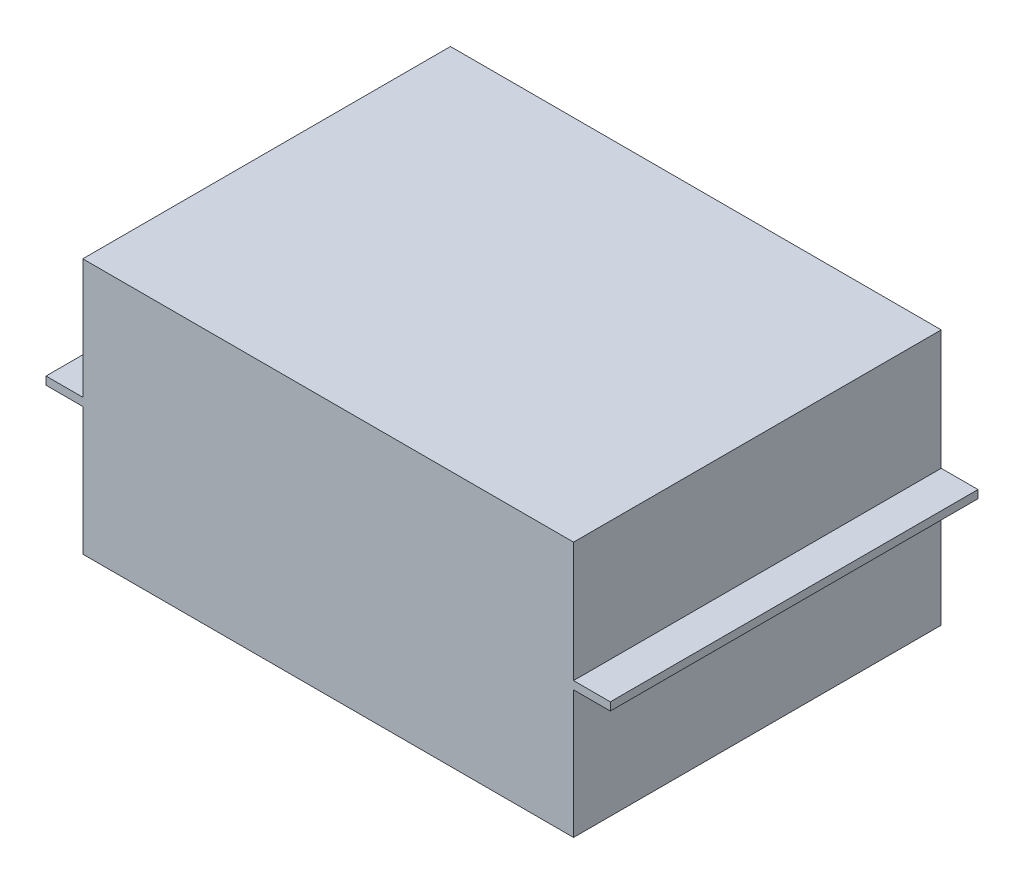
ISO-10303-21;
HEADER;
FILE_DESCRIPTION(('STEP AP214'),'2;1');
FILE_NAME('part.step','',(''),(''),'','','');
FILE_SCHEMA(('AUTOMOTIVE_DESIGN { 1 0 10303 214 1 1 1 1 }'));
ENDSEC;
DATA;
#1=APPLICATION_CONTEXT('core data for automotive mechanical design processes');
#2=APPLICATION_PROTOCOL_DEFINITION('international standard','automotive_design',2000,#1);
#3=PRODUCT_CONTEXT('',#1,'mechanical');
#4=PRODUCT('Part','Part','',(#3));
#5=PRODUCT_RELATED_PRODUCT_CATEGORY('part','',(#4));
#6=PRODUCT_DEFINITION_FORMATION('','',#4);
#7=PRODUCT_DEFINITION_CONTEXT('part definition',#1,'design');
#8=PRODUCT_DEFINITION('design','',#6,#7);
#9=PRODUCT_DEFINITION_SHAPE('','',#8);
#10=(LENGTH_UNIT() NAMED_UNIT(*) SI_UNIT(.MILLI.,.METRE.));
#11=(NAMED_UNIT(*) PLANE_ANGLE_UNIT() SI_UNIT($,.RADIAN.));
#12=(NAMED_UNIT(*) SI_UNIT($,.STERADIAN.) SOLID_ANGLE_UNIT());
#13=UNCERTAINTY_MEASURE_WITH_UNIT(LENGTH_MEASURE(1.E-05),#10,'distance_accuracy_value','');
#14=(GEOMETRIC_REPRESENTATION_CONTEXT(3) GLOBAL_UNCERTAINTY_ASSIGNED_CONTEXT((#13)) GLOBAL_UNIT_ASSIGNED_CONTEXT((#10,
#11,#12)) REPRESENTATION_CONTEXT('',''));
#15=CARTESIAN_POINT('',(0.,0.,0.));
#16=DIRECTION('',(0.,0.,1.));
#17=DIRECTION('',(1.,0.,0.));
#18=AXIS2_PLACEMENT_3D('',#15,#16,#17);
#19=CARTESIAN_POINT('',(153.5,160.,0.));
#20=DIRECTION('',(-1.,0.,0.));
#21=DIRECTION('',(0.,0.,1.));
#22=AXIS2_PLACEMENT_3D('',#19,#20,#21);
#23=PLANE('',#22);
#24=DIRECTION('',(0.,0.,-1.));
#25=VECTOR('',#24,1.);
#26=CARTESIAN_POINT('',(153.5,80.,0.));
#27=LINE('',#26,#25);
#28=CARTESIAN_POINT('',(153.5,80.,115.));
#29=VERTEX_POINT('',#28);
#30=CARTESIAN_POINT('',(153.5,80.,-115.));
#31=VERTEX_POINT('',#30);
#32=EDGE_CURVE('E154',#29,#31,#27,.T.);
#33=ORIENTED_EDGE('',*,*,#32,.F.);
#34=DIRECTION('',(0.,-1.,0.));
#35=VECTOR('',#34,1.);
#36=CARTESIAN_POINT('',(153.5,160.,115.));
#37=LINE('',#36,#35);
#38=CARTESIAN_POINT('',(153.5,0.,115.));
#39=VERTEX_POINT('',#38);
#40=EDGE_CURVE('E56',#29,#39,#37,.T.);
#41=ORIENTED_EDGE('',*,*,#40,.T.);
#42=DIRECTION('',(0.,0.,-1.));
#43=VECTOR('',#42,1.);
#44=CARTESIAN_POINT('',(153.5,0.,0.));
#45=LINE('',#44,#43);
#46=CARTESIAN_POINT('',(153.5,0.,-115.));
#47=VERTEX_POINT('',#46);
#48=EDGE_CURVE('E221',#39,#47,#45,.T.);
#49=ORIENTED_EDGE('',*,*,#48,.T.);
#50=DIRECTION('',(0.,-1.,0.));
#51=VECTOR('',#50,1.);
#52=CARTESIAN_POINT('',(153.5,160.,-115.));
#53=LINE('',#52,#51);
#54=EDGE_CURVE('E239',#31,#47,#53,.T.);
#55=ORIENTED_EDGE('',*,*,#54,.F.);
#56=EDGE_LOOP('',(#33,#41,#49,#55));
#57=FACE_BOUND('',#56,.T.);
#58=ADVANCED_FACE('F47',(#57),#23,.F.);
#59=CARTESIAN_POINT('',(-153.5,160.,0.));
#60=DIRECTION('',(-1.,0.,0.));
#61=DIRECTION('',(0.,0.,1.));
#62=AXIS2_PLACEMENT_3D('',#59,#60,#61);
#63=PLANE('',#62);
#64=DIRECTION('',(0.,-1.,0.));
#65=VECTOR('',#64,1.);
#66=CARTESIAN_POINT('',(-153.5,160.,115.));
#67=LINE('',#66,#65);
#68=CARTESIAN_POINT('',(-153.5,80.,115.));
#69=VERTEX_POINT('',#68);
#70=CARTESIAN_POINT('',(-153.5,0.,115.));
#71=VERTEX_POINT('',#70);
#72=EDGE_CURVE('E218',#69,#71,#67,.T.);
#73=ORIENTED_EDGE('',*,*,#72,.F.);
#74=DIRECTION('',(0.,0.,-1.));
#75=VECTOR('',#74,1.);
#76=CARTESIAN_POINT('',(-153.5,80.,0.));
#77=LINE('',#76,#75);
#78=CARTESIAN_POINT('',(-153.5,80.,-115.));
#79=VERTEX_POINT('',#78);
#80=EDGE_CURVE('E71',#69,#79,#77,.T.);
#81=ORIENTED_EDGE('',*,*,#80,.T.);
#82=DIRECTION('',(0.,-1.,0.));
#83=VECTOR('',#82,1.);
#84=CARTESIAN_POINT('',(-153.5,160.,-115.));
#85=LINE('',#84,#83);
#86=CARTESIAN_POINT('',(-153.5,0.,-115.));
#87=VERTEX_POINT('',#86);
#88=EDGE_CURVE('E236',#79,#87,#85,.T.);
#89=ORIENTED_EDGE('',*,*,#88,.T.);
#90=DIRECTION('',(0.,0.,-1.));
#91=VECTOR('',#90,1.);
#92=CARTESIAN_POINT('',(-153.5,0.,0.));
#93=LINE('',#92,#91);
#94=EDGE_CURVE('E207',#71,#87,#93,.T.);
#95=ORIENTED_EDGE('',*,*,#94,.F.);
#96=EDGE_LOOP('',(#73,#81,#89,#95));
#97=FACE_BOUND('',#96,.T.);
#98=ADVANCED_FACE('F260',(#97),#63,.T.);
#99=CARTESIAN_POINT('',(0.,160.,115.));
#100=DIRECTION('',(0.,0.,-1.));
#101=DIRECTION('',(-1.,0.,0.));
#102=AXIS2_PLACEMENT_3D('',#99,#100,#101);
#103=PLANE('',#102);
#104=DIRECTION('',(1.,0.,0.));
#105=VECTOR('',#104,1.);
#106=CARTESIAN_POINT('',(0.,0.,115.));
#107=LINE('',#106,#105);
#108=EDGE_CURVE('E201',#71,#39,#107,.T.);
#109=ORIENTED_EDGE('',*,*,#108,.T.);
#110=ORIENTED_EDGE('',*,*,#40,.F.);
#111=DIRECTION('',(1.,0.,0.));
#112=VECTOR('',#111,1.);
#113=CARTESIAN_POINT('',(0.,80.,115.));
#114=LINE('',#113,#112);
#115=CARTESIAN_POINT('',(176.5,80.,115.));
#116=VERTEX_POINT('',#115);
#117=EDGE_CURVE('E158',#29,#116,#114,.T.);
#118=ORIENTED_EDGE('',*,*,#117,.T.);
#119=DIRECTION('',(0.,-1.,0.));
#120=VECTOR('',#119,1.);
#121=CARTESIAN_POINT('',(176.5,85.,115.));
#122=LINE('',#121,#120);
#123=CARTESIAN_POINT('',(176.5,85.,115.));
#124=VERTEX_POINT('',#123);
#125=EDGE_CURVE('E143',#124,#116,#122,.T.);
#126=ORIENTED_EDGE('',*,*,#125,.F.);
#127=DIRECTION('',(1.,0.,0.));
#128=VECTOR('',#127,1.);
#129=CARTESIAN_POINT('',(0.,85.,115.));
#130=LINE('',#129,#128);
#131=CARTESIAN_POINT('',(153.5,85.,115.));
#132=VERTEX_POINT('',#131);
#133=EDGE_CURVE('E147',#132,#124,#130,.T.);
#134=ORIENTED_EDGE('',*,*,#133,.F.);
#135=CARTESIAN_POINT('',(153.5,160.,115.));
#136=VERTEX_POINT('',#135);
#137=EDGE_CURVE('E11',#136,#132,#37,.T.);
#138=ORIENTED_EDGE('',*,*,#137,.F.);
#139=DIRECTION('',(1.,0.,0.));
#140=VECTOR('',#139,1.);
#141=CARTESIAN_POINT('',(0.,160.,115.));
#142=LINE('',#141,#140);
#143=CARTESIAN_POINT('',(-153.5,160.,115.));
#144=VERTEX_POINT('',#143);
#145=EDGE_CURVE('E202',#144,#136,#142,.T.);
#146=ORIENTED_EDGE('',*,*,#145,.F.);
#147=CARTESIAN_POINT('',(-153.5,85.,115.));
#148=VERTEX_POINT('',#147);
#149=EDGE_CURVE('E232',#144,#148,#67,.T.);
#150=ORIENTED_EDGE('',*,*,#149,.T.);
#151=DIRECTION('',(1.,0.,0.));
#152=VECTOR('',#151,1.);
#153=CARTESIAN_POINT('',(0.,85.,115.));
#154=LINE('',#153,#152);
#155=CARTESIAN_POINT('',(-176.5,85.,115.));
#156=VERTEX_POINT('',#155);
#157=EDGE_CURVE('E178',#156,#148,#154,.T.);
#158=ORIENTED_EDGE('',*,*,#157,.F.);
#159=DIRECTION('',(0.,-1.,0.));
#160=VECTOR('',#159,1.);
#161=CARTESIAN_POINT('',(-176.5,85.,115.));
#162=LINE('',#161,#160);
#163=CARTESIAN_POINT('',(-176.5,80.,115.));
#164=VERTEX_POINT('',#163);
#165=EDGE_CURVE('E185',#156,#164,#162,.T.);
#166=ORIENTED_EDGE('',*,*,#165,.T.);
#167=DIRECTION('',(1.,0.,0.));
#168=VECTOR('',#167,1.);
#169=CARTESIAN_POINT('',(0.,80.,115.));
#170=LINE('',#169,#168);
#171=EDGE_CURVE('E190',#164,#69,#170,.T.);
#172=ORIENTED_EDGE('',*,*,#171,.T.);
#173=ORIENTED_EDGE('',*,*,#72,.T.);
#174=EDGE_LOOP('',(#109,#110,#118,#126,#134,#138,#146,#150,#158,#166,#172,#173));
#175=FACE_BOUND('',#174,.T.);
#176=ADVANCED_FACE('F49',(#175),#103,.F.);
#177=ORIENTED_EDGE('',*,*,#137,.T.);
#178=DIRECTION('',(0.,0.,-1.));
#179=VECTOR('',#178,1.);
#180=CARTESIAN_POINT('',(153.5,85.,0.));
#181=LINE('',#180,#179);
#182=CARTESIAN_POINT('',(153.5,85.,-115.));
#183=VERTEX_POINT('',#182);
#184=EDGE_CURVE('E150',#132,#183,#181,.T.);
#185=ORIENTED_EDGE('',*,*,#184,.T.);
#186=CARTESIAN_POINT('',(153.5,160.,-115.));
#187=VERTEX_POINT('',#186);
#188=EDGE_CURVE('E240',#187,#183,#53,.T.);
#189=ORIENTED_EDGE('',*,*,#188,.F.);
#190=DIRECTION('',(0.,0.,-1.));
#191=VECTOR('',#190,1.);
#192=CARTESIAN_POINT('',(153.5,160.,0.));
#193=LINE('',#192,#191);
#194=EDGE_CURVE('E206',#136,#187,#193,.T.);
#195=ORIENTED_EDGE('',*,*,#194,.F.);
#196=EDGE_LOOP('',(#177,#185,#189,#195));
#197=FACE_BOUND('',#196,.T.);
#198=ADVANCED_FACE('F283',(#197),#23,.F.);
#199=CARTESIAN_POINT('',(0.,160.,-115.));
#200=DIRECTION('',(0.,0.,-1.));
#201=DIRECTION('',(-1.,0.,0.));
#202=AXIS2_PLACEMENT_3D('',#199,#200,#201);
#203=PLANE('',#202);
#204=DIRECTION('',(1.,0.,0.));
#205=VECTOR('',#204,1.);
#206=CARTESIAN_POINT('',(0.,0.,-115.));
#207=LINE('',#206,#205);
#208=EDGE_CURVE('E225',#87,#47,#207,.T.);
#209=ORIENTED_EDGE('',*,*,#208,.F.);
#210=ORIENTED_EDGE('',*,*,#88,.F.);
#211=DIRECTION('',(1.,0.,0.));
#212=VECTOR('',#211,1.);
#213=CARTESIAN_POINT('',(0.,80.,-115.));
#214=LINE('',#213,#212);
#215=CARTESIAN_POINT('',(-176.5,80.,-115.));
#216=VERTEX_POINT('',#215);
#217=EDGE_CURVE('E160',#216,#79,#214,.T.);
#218=ORIENTED_EDGE('',*,*,#217,.F.);
#219=DIRECTION('',(0.,-1.,0.));
#220=VECTOR('',#219,1.);
#221=CARTESIAN_POINT('',(-176.5,85.,-115.));
#222=LINE('',#221,#220);
#223=CARTESIAN_POINT('',(-176.5,85.,-115.));
#224=VERTEX_POINT('',#223);
#225=EDGE_CURVE('E198',#224,#216,#222,.T.);
#226=ORIENTED_EDGE('',*,*,#225,.F.);
#227=DIRECTION('',(1.,0.,0.));
#228=VECTOR('',#227,1.);
#229=CARTESIAN_POINT('',(0.,85.,-115.));
#230=LINE('',#229,#228);
#231=CARTESIAN_POINT('',(-153.5,85.,-115.));
#232=VERTEX_POINT('',#231);
#233=EDGE_CURVE('E170',#224,#232,#230,.T.);
#234=ORIENTED_EDGE('',*,*,#233,.T.);
#235=CARTESIAN_POINT('',(-153.5,160.,-115.));
#236=VERTEX_POINT('',#235);
#237=EDGE_CURVE('E237',#236,#232,#85,.T.);
#238=ORIENTED_EDGE('',*,*,#237,.F.);
#239=DIRECTION('',(1.,0.,0.));
#240=VECTOR('',#239,1.);
#241=CARTESIAN_POINT('',(0.,160.,-115.));
#242=LINE('',#241,#240);
#243=EDGE_CURVE('E210',#236,#187,#242,.T.);
#244=ORIENTED_EDGE('',*,*,#243,.T.);
#245=ORIENTED_EDGE('',*,*,#188,.T.);
#246=DIRECTION('',(1.,0.,0.));
#247=VECTOR('',#246,1.);
#248=CARTESIAN_POINT('',(0.,85.,-115.));
#249=LINE('',#248,#247);
#250=CARTESIAN_POINT('',(176.5,85.,-115.));
#251=VERTEX_POINT('',#250);
#252=EDGE_CURVE('E63',#183,#251,#249,.T.);
#253=ORIENTED_EDGE('',*,*,#252,.T.);
#254=DIRECTION('',(0.,-1.,0.));
#255=VECTOR('',#254,1.);
#256=CARTESIAN_POINT('',(176.5,85.,-115.));
#257=LINE('',#256,#255);
#258=CARTESIAN_POINT('',(176.5,80.,-115.));
#259=VERTEX_POINT('',#258);
#260=EDGE_CURVE('E145',#251,#259,#257,.T.);
#261=ORIENTED_EDGE('',*,*,#260,.T.);
#262=DIRECTION('',(1.,0.,0.));
#263=VECTOR('',#262,1.);
#264=CARTESIAN_POINT('',(0.,80.,-115.));
#265=LINE('',#264,#263);
#266=EDGE_CURVE('E251',#31,#259,#265,.T.);
#267=ORIENTED_EDGE('',*,*,#266,.F.);
#268=ORIENTED_EDGE('',*,*,#54,.T.);
#269=EDGE_LOOP('',(#209,#210,#218,#226,#234,#238,#244,#245,#253,#261,#267,#268));
#270=FACE_BOUND('',#269,.T.);
#271=ADVANCED_FACE('F249',(#270),#203,.T.);
#272=DIRECTION('',(0.,0.,-1.));
#273=VECTOR('',#272,1.);
#274=CARTESIAN_POINT('',(-153.5,85.,0.));
#275=LINE('',#274,#273);
#276=EDGE_CURVE('E182',#148,#232,#275,.T.);
#277=ORIENTED_EDGE('',*,*,#276,.F.);
#278=ORIENTED_EDGE('',*,*,#149,.F.);
#279=DIRECTION('',(0.,0.,-1.));
#280=VECTOR('',#279,1.);
#281=CARTESIAN_POINT('',(-153.5,160.,0.));
#282=LINE('',#281,#280);
#283=EDGE_CURVE('E214',#144,#236,#282,.T.);
#284=ORIENTED_EDGE('',*,*,#283,.T.);
#285=ORIENTED_EDGE('',*,*,#237,.T.);
#286=EDGE_LOOP('',(#277,#278,#284,#285));
#287=FACE_BOUND('',#286,.T.);
#288=ADVANCED_FACE('F278',(#287),#63,.T.);
#289=CARTESIAN_POINT('',(0.,160.,0.));
#290=DIRECTION('',(0.,1.,0.));
#291=DIRECTION('',(0.,0.,1.));
#292=AXIS2_PLACEMENT_3D('',#289,#290,#291);
#293=PLANE('',#292);
#294=ORIENTED_EDGE('',*,*,#145,.T.);
#295=ORIENTED_EDGE('',*,*,#194,.T.);
#296=ORIENTED_EDGE('',*,*,#243,.F.);
#297=ORIENTED_EDGE('',*,*,#283,.F.);
#298=EDGE_LOOP('',(#294,#295,#296,#297));
#299=FACE_BOUND('',#298,.T.);
#300=ADVANCED_FACE('F281',(#299),#293,.T.);
#301=CARTESIAN_POINT('',(0.,0.,0.));
#302=DIRECTION('',(0.,1.,0.));
#303=DIRECTION('',(0.,0.,1.));
#304=AXIS2_PLACEMENT_3D('',#301,#302,#303);
#305=PLANE('',#304);
#306=ORIENTED_EDGE('',*,*,#108,.F.);
#307=ORIENTED_EDGE('',*,*,#94,.T.);
#308=ORIENTED_EDGE('',*,*,#208,.T.);
#309=ORIENTED_EDGE('',*,*,#48,.F.);
#310=EDGE_LOOP('',(#306,#307,#308,#309));
#311=FACE_BOUND('',#310,.T.);
#312=ADVANCED_FACE('F258',(#311),#305,.F.);
#313=CARTESIAN_POINT('',(-176.5,85.,0.));
#314=DIRECTION('',(-1.,0.,0.));
#315=DIRECTION('',(0.,0.,1.));
#316=AXIS2_PLACEMENT_3D('',#313,#314,#315);
#317=PLANE('',#316);
#318=DIRECTION('',(0.,0.,-1.));
#319=VECTOR('',#318,1.);
#320=CARTESIAN_POINT('',(-176.5,80.,0.));
#321=LINE('',#320,#319);
#322=EDGE_CURVE('E165',#164,#216,#321,.T.);
#323=ORIENTED_EDGE('',*,*,#322,.F.);
#324=ORIENTED_EDGE('',*,*,#165,.F.);
#325=DIRECTION('',(0.,0.,-1.));
#326=VECTOR('',#325,1.);
#327=CARTESIAN_POINT('',(-176.5,85.,0.));
#328=LINE('',#327,#326);
#329=EDGE_CURVE('E174',#156,#224,#328,.T.);
#330=ORIENTED_EDGE('',*,*,#329,.T.);
#331=ORIENTED_EDGE('',*,*,#225,.T.);
#332=EDGE_LOOP('',(#323,#324,#330,#331));
#333=FACE_BOUND('',#332,.T.);
#334=ADVANCED_FACE('F274',(#333),#317,.T.);
#335=CARTESIAN_POINT('',(0.,85.,0.));
#336=DIRECTION('',(0.,1.,0.));
#337=DIRECTION('',(0.,0.,1.));
#338=AXIS2_PLACEMENT_3D('',#335,#336,#337);
#339=PLANE('',#338);
#340=ORIENTED_EDGE('',*,*,#233,.F.);
#341=ORIENTED_EDGE('',*,*,#329,.F.);
#342=ORIENTED_EDGE('',*,*,#157,.T.);
#343=ORIENTED_EDGE('',*,*,#276,.T.);
#344=EDGE_LOOP('',(#340,#341,#342,#343));
#345=FACE_BOUND('',#344,.T.);
#346=ADVANCED_FACE('F273',(#345),#339,.T.);
#347=CARTESIAN_POINT('',(0.,80.,0.));
#348=DIRECTION('',(0.,1.,0.));
#349=DIRECTION('',(0.,0.,1.));
#350=AXIS2_PLACEMENT_3D('',#347,#348,#349);
#351=PLANE('',#350);
#352=ORIENTED_EDGE('',*,*,#217,.T.);
#353=ORIENTED_EDGE('',*,*,#80,.F.);
#354=ORIENTED_EDGE('',*,*,#171,.F.);
#355=ORIENTED_EDGE('',*,*,#322,.T.);
#356=EDGE_LOOP('',(#352,#353,#354,#355));
#357=FACE_BOUND('',#356,.T.);
#358=ADVANCED_FACE('F268',(#357),#351,.F.);
#359=CARTESIAN_POINT('',(176.5,85.,0.));
#360=DIRECTION('',(-1.,0.,0.));
#361=DIRECTION('',(0.,0.,1.));
#362=AXIS2_PLACEMENT_3D('',#359,#360,#361);
#363=PLANE('',#362);
#364=DIRECTION('',(0.,0.,-1.));
#365=VECTOR('',#364,1.);
#366=CARTESIAN_POINT('',(176.5,80.,0.));
#367=LINE('',#366,#365);
#368=EDGE_CURVE('E291',#116,#259,#367,.T.);
#369=ORIENTED_EDGE('',*,*,#368,.T.);
#370=ORIENTED_EDGE('',*,*,#260,.F.);
#371=DIRECTION('',(0.,0.,-1.));
#372=VECTOR('',#371,1.);
#373=CARTESIAN_POINT('',(176.5,85.,0.));
#374=LINE('',#373,#372);
#375=EDGE_CURVE('E138',#124,#251,#374,.T.);
#376=ORIENTED_EDGE('',*,*,#375,.F.);
#377=ORIENTED_EDGE('',*,*,#125,.T.);
#378=EDGE_LOOP('',(#369,#370,#376,#377));
#379=FACE_BOUND('',#378,.T.);
#380=ADVANCED_FACE('F141',(#379),#363,.F.);
#381=CARTESIAN_POINT('',(0.,85.,0.));
#382=DIRECTION('',(0.,1.,0.));
#383=DIRECTION('',(0.,0.,1.));
#384=AXIS2_PLACEMENT_3D('',#381,#382,#383);
#385=PLANE('',#384);
#386=ORIENTED_EDGE('',*,*,#133,.T.);
#387=ORIENTED_EDGE('',*,*,#375,.T.);
#388=ORIENTED_EDGE('',*,*,#252,.F.);
#389=ORIENTED_EDGE('',*,*,#184,.F.);
#390=EDGE_LOOP('',(#386,#387,#388,#389));
#391=FACE_BOUND('',#390,.T.);
#392=ADVANCED_FACE('F149',(#391),#385,.T.);
#393=CARTESIAN_POINT('',(0.,80.,0.));
#394=DIRECTION('',(0.,1.,0.));
#395=DIRECTION('',(0.,0.,1.));
#396=AXIS2_PLACEMENT_3D('',#393,#394,#395);
#397=PLANE('',#396);
#398=ORIENTED_EDGE('',*,*,#117,.F.);
#399=ORIENTED_EDGE('',*,*,#32,.T.);
#400=ORIENTED_EDGE('',*,*,#266,.T.);
#401=ORIENTED_EDGE('',*,*,#368,.F.);
#402=EDGE_LOOP('',(#398,#399,#400,#401));
#403=FACE_BOUND('',#402,.T.);
#404=ADVANCED_FACE('F297',(#403),#397,.F.);
#405=CLOSED_SHELL('',(#58,#98,#176,#198,#271,#288,#300,#312,#334,#346,#358,#380,#392,#404));
#406=MANIFOLD_SOLID_BREP('B2',#405);
#407=ADVANCED_BREP_SHAPE_REPRESENTATION('',(#18,#406),#14);
#408=SHAPE_DEFINITION_REPRESENTATION(#9,#407);
ENDSEC;
END-ISO-10303-21;
